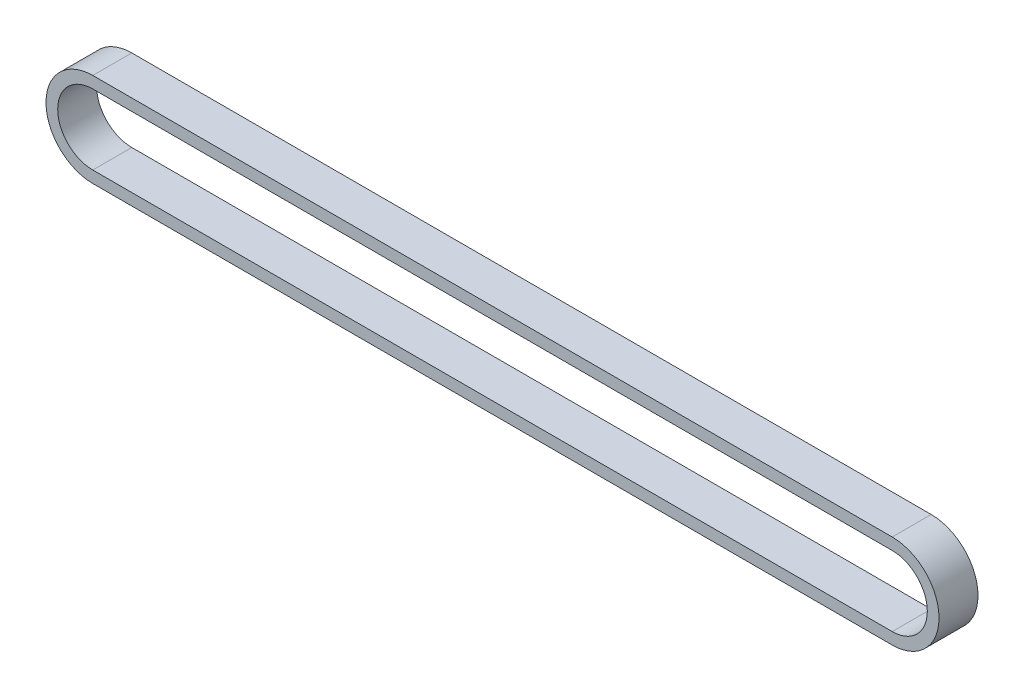
ISO-10303-21;
HEADER;
FILE_DESCRIPTION(('STEP AP214'),'2;1');
FILE_NAME('part.step','',(''),(''),'','','');
FILE_SCHEMA(('AUTOMOTIVE_DESIGN { 1 0 10303 214 1 1 1 1 }'));
ENDSEC;
DATA;
#1=APPLICATION_CONTEXT('core data for automotive mechanical design processes');
#2=APPLICATION_PROTOCOL_DEFINITION('international standard','automotive_design',2000,#1);
#3=PRODUCT_CONTEXT('',#1,'mechanical');
#4=PRODUCT('Part','Part','',(#3));
#5=PRODUCT_RELATED_PRODUCT_CATEGORY('part','',(#4));
#6=PRODUCT_DEFINITION_FORMATION('','',#4);
#7=PRODUCT_DEFINITION_CONTEXT('part definition',#1,'design');
#8=PRODUCT_DEFINITION('design','',#6,#7);
#9=PRODUCT_DEFINITION_SHAPE('','',#8);
#10=(LENGTH_UNIT() NAMED_UNIT(*) SI_UNIT(.MILLI.,.METRE.));
#11=(NAMED_UNIT(*) PLANE_ANGLE_UNIT() SI_UNIT($,.RADIAN.));
#12=(NAMED_UNIT(*) SI_UNIT($,.STERADIAN.) SOLID_ANGLE_UNIT());
#13=UNCERTAINTY_MEASURE_WITH_UNIT(LENGTH_MEASURE(1.E-05),#10,'distance_accuracy_value','');
#14=(GEOMETRIC_REPRESENTATION_CONTEXT(3) GLOBAL_UNCERTAINTY_ASSIGNED_CONTEXT((#13)) GLOBAL_UNIT_ASSIGNED_CONTEXT((#10,
#11,#12)) REPRESENTATION_CONTEXT('',''));
#15=CARTESIAN_POINT('',(0.,0.,0.));
#16=DIRECTION('',(0.,0.,1.));
#17=DIRECTION('',(1.,0.,0.));
#18=AXIS2_PLACEMENT_3D('',#15,#16,#17);
#19=CARTESIAN_POINT('',(0.,0.,10.));
#20=DIRECTION('',(0.,0.,1.));
#21=DIRECTION('',(1.,0.,0.));
#22=AXIS2_PLACEMENT_3D('',#19,#20,#21);
#23=PLANE('',#22);
#24=CARTESIAN_POINT('',(0.,0.,10.));
#25=DIRECTION('',(0.,0.,1.));
#26=DIRECTION('',(1.,0.,0.));
#27=AXIS2_PLACEMENT_3D('',#24,#25,#26);
#28=CIRCLE('',#27,12.);
#29=CARTESIAN_POINT('',(0.,12.,10.));
#30=VERTEX_POINT('',#29);
#31=CARTESIAN_POINT('',(0.,-12.,10.));
#32=VERTEX_POINT('',#31);
#33=EDGE_CURVE('E142',#30,#32,#28,.T.);
#34=ORIENTED_EDGE('',*,*,#33,.T.);
#35=DIRECTION('',(1.,0.,0.));
#36=VECTOR('',#35,1.);
#37=CARTESIAN_POINT('',(0.,-12.,10.));
#38=LINE('',#37,#36);
#39=CARTESIAN_POINT('',(205.,-12.,10.));
#40=VERTEX_POINT('',#39);
#41=EDGE_CURVE('E145',#32,#40,#38,.T.);
#42=ORIENTED_EDGE('',*,*,#41,.T.);
#43=CARTESIAN_POINT('',(205.,0.,10.));
#44=DIRECTION('',(0.,0.,1.));
#45=DIRECTION('',(1.,0.,0.));
#46=AXIS2_PLACEMENT_3D('',#43,#44,#45);
#47=CIRCLE('',#46,12.);
#48=CARTESIAN_POINT('',(205.,12.,10.));
#49=VERTEX_POINT('',#48);
#50=EDGE_CURVE('E148',#40,#49,#47,.T.);
#51=ORIENTED_EDGE('',*,*,#50,.T.);
#52=DIRECTION('',(-1.,0.,0.));
#53=VECTOR('',#52,1.);
#54=CARTESIAN_POINT('',(0.,12.,10.));
#55=LINE('',#54,#53);
#56=EDGE_CURVE('E150',#49,#30,#55,.T.);
#57=ORIENTED_EDGE('',*,*,#56,.T.);
#58=EDGE_LOOP('',(#34,#42,#51,#57));
#59=FACE_BOUND('',#58,.T.);
#60=DIRECTION('',(1.,0.,0.));
#61=VECTOR('',#60,1.);
#62=CARTESIAN_POINT('',(0.,-9.,10.));
#63=LINE('',#62,#61);
#64=CARTESIAN_POINT('',(0.,-9.,10.));
#65=VERTEX_POINT('',#64);
#66=CARTESIAN_POINT('',(205.,-9.,10.));
#67=VERTEX_POINT('',#66);
#68=EDGE_CURVE('E114',#65,#67,#63,.T.);
#69=ORIENTED_EDGE('',*,*,#68,.F.);
#70=CARTESIAN_POINT('',(0.,0.,10.));
#71=DIRECTION('',(0.,0.,1.));
#72=DIRECTION('',(1.,0.,0.));
#73=AXIS2_PLACEMENT_3D('',#70,#71,#72);
#74=CIRCLE('',#73,9.);
#75=CARTESIAN_POINT('',(0.,9.,10.));
#76=VERTEX_POINT('',#75);
#77=EDGE_CURVE('E106',#76,#65,#74,.T.);
#78=ORIENTED_EDGE('',*,*,#77,.F.);
#79=DIRECTION('',(-1.,0.,0.));
#80=VECTOR('',#79,1.);
#81=CARTESIAN_POINT('',(0.,9.,10.));
#82=LINE('',#81,#80);
#83=CARTESIAN_POINT('',(205.,9.,10.));
#84=VERTEX_POINT('',#83);
#85=EDGE_CURVE('E128',#84,#76,#82,.T.);
#86=ORIENTED_EDGE('',*,*,#85,.F.);
#87=CARTESIAN_POINT('',(205.,0.,10.));
#88=DIRECTION('',(0.,0.,1.));
#89=DIRECTION('',(1.,0.,0.));
#90=AXIS2_PLACEMENT_3D('',#87,#88,#89);
#91=CIRCLE('',#90,9.);
#92=EDGE_CURVE('E126',#67,#84,#91,.T.);
#93=ORIENTED_EDGE('',*,*,#92,.F.);
#94=EDGE_LOOP('',(#69,#78,#86,#93));
#95=FACE_BOUND('',#94,.T.);
#96=ADVANCED_FACE('F41',(#59,#95),#23,.T.);
#97=CARTESIAN_POINT('',(0.,0.,0.));
#98=DIRECTION('',(0.,0.,1.));
#99=DIRECTION('',(1.,0.,0.));
#100=AXIS2_PLACEMENT_3D('',#97,#98,#99);
#101=PLANE('',#100);
#102=CARTESIAN_POINT('',(0.,0.,0.));
#103=DIRECTION('',(0.,0.,1.));
#104=DIRECTION('',(1.,0.,0.));
#105=AXIS2_PLACEMENT_3D('',#102,#103,#104);
#106=CIRCLE('',#105,12.);
#107=CARTESIAN_POINT('',(0.,12.,0.));
#108=VERTEX_POINT('',#107);
#109=CARTESIAN_POINT('',(0.,-12.,0.));
#110=VERTEX_POINT('',#109);
#111=EDGE_CURVE('E122',#108,#110,#106,.T.);
#112=ORIENTED_EDGE('',*,*,#111,.F.);
#113=DIRECTION('',(-1.,0.,0.));
#114=VECTOR('',#113,1.);
#115=CARTESIAN_POINT('',(0.,12.,0.));
#116=LINE('',#115,#114);
#117=CARTESIAN_POINT('',(205.,12.,0.));
#118=VERTEX_POINT('',#117);
#119=EDGE_CURVE('E146',#118,#108,#116,.T.);
#120=ORIENTED_EDGE('',*,*,#119,.F.);
#121=CARTESIAN_POINT('',(205.,0.,0.));
#122=DIRECTION('',(0.,0.,1.));
#123=DIRECTION('',(1.,0.,0.));
#124=AXIS2_PLACEMENT_3D('',#121,#122,#123);
#125=CIRCLE('',#124,12.);
#126=CARTESIAN_POINT('',(205.,-12.,0.));
#127=VERTEX_POINT('',#126);
#128=EDGE_CURVE('E157',#127,#118,#125,.T.);
#129=ORIENTED_EDGE('',*,*,#128,.F.);
#130=DIRECTION('',(1.,0.,0.));
#131=VECTOR('',#130,1.);
#132=CARTESIAN_POINT('',(0.,-12.,0.));
#133=LINE('',#132,#131);
#134=EDGE_CURVE('E155',#110,#127,#133,.T.);
#135=ORIENTED_EDGE('',*,*,#134,.F.);
#136=EDGE_LOOP('',(#112,#120,#129,#135));
#137=FACE_BOUND('',#136,.T.);
#138=CARTESIAN_POINT('',(0.,0.,0.));
#139=DIRECTION('',(0.,0.,1.));
#140=DIRECTION('',(1.,0.,0.));
#141=AXIS2_PLACEMENT_3D('',#138,#139,#140);
#142=CIRCLE('',#141,9.);
#143=CARTESIAN_POINT('',(0.,9.,0.));
#144=VERTEX_POINT('',#143);
#145=CARTESIAN_POINT('',(0.,-9.,0.));
#146=VERTEX_POINT('',#145);
#147=EDGE_CURVE('E64',#144,#146,#142,.T.);
#148=ORIENTED_EDGE('',*,*,#147,.T.);
#149=DIRECTION('',(1.,0.,0.));
#150=VECTOR('',#149,1.);
#151=CARTESIAN_POINT('',(0.,-9.,0.));
#152=LINE('',#151,#150);
#153=CARTESIAN_POINT('',(205.,-9.,0.));
#154=VERTEX_POINT('',#153);
#155=EDGE_CURVE('E121',#146,#154,#152,.T.);
#156=ORIENTED_EDGE('',*,*,#155,.T.);
#157=CARTESIAN_POINT('',(205.,0.,0.));
#158=DIRECTION('',(0.,0.,1.));
#159=DIRECTION('',(1.,0.,0.));
#160=AXIS2_PLACEMENT_3D('',#157,#158,#159);
#161=CIRCLE('',#160,9.);
#162=CARTESIAN_POINT('',(205.,9.,0.));
#163=VERTEX_POINT('',#162);
#164=EDGE_CURVE('E134',#154,#163,#161,.T.);
#165=ORIENTED_EDGE('',*,*,#164,.T.);
#166=DIRECTION('',(-1.,0.,0.));
#167=VECTOR('',#166,1.);
#168=CARTESIAN_POINT('',(0.,9.,0.));
#169=LINE('',#168,#167);
#170=EDGE_CURVE('E115',#163,#144,#169,.T.);
#171=ORIENTED_EDGE('',*,*,#170,.T.);
#172=EDGE_LOOP('',(#148,#156,#165,#171));
#173=FACE_BOUND('',#172,.T.);
#174=ADVANCED_FACE('F175',(#137,#173),#101,.F.);
#175=CARTESIAN_POINT('',(0.,0.,10.));
#176=DIRECTION('',(0.,0.,-1.));
#177=DIRECTION('',(-1.,0.,0.));
#178=AXIS2_PLACEMENT_3D('',#175,#176,#177);
#179=CYLINDRICAL_SURFACE('',#178,12.);
#180=ORIENTED_EDGE('',*,*,#111,.T.);
#181=DIRECTION('',(0.,0.,-1.));
#182=VECTOR('',#181,1.);
#183=CARTESIAN_POINT('',(0.,-12.,10.));
#184=LINE('',#183,#182);
#185=EDGE_CURVE('E11',#32,#110,#184,.T.);
#186=ORIENTED_EDGE('',*,*,#185,.F.);
#187=ORIENTED_EDGE('',*,*,#33,.F.);
#188=DIRECTION('',(0.,0.,-1.));
#189=VECTOR('',#188,1.);
#190=CARTESIAN_POINT('',(0.,12.,10.));
#191=LINE('',#190,#189);
#192=EDGE_CURVE('E152',#30,#108,#191,.T.);
#193=ORIENTED_EDGE('',*,*,#192,.T.);
#194=EDGE_LOOP('',(#180,#186,#187,#193));
#195=FACE_BOUND('',#194,.T.);
#196=ADVANCED_FACE('F43',(#195),#179,.T.);
#197=CARTESIAN_POINT('',(0.,-12.,10.));
#198=DIRECTION('',(0.,1.,0.));
#199=DIRECTION('',(0.,0.,1.));
#200=AXIS2_PLACEMENT_3D('',#197,#198,#199);
#201=PLANE('',#200);
#202=ORIENTED_EDGE('',*,*,#134,.T.);
#203=DIRECTION('',(0.,0.,-1.));
#204=VECTOR('',#203,1.);
#205=CARTESIAN_POINT('',(205.,-12.,10.));
#206=LINE('',#205,#204);
#207=EDGE_CURVE('E49',#40,#127,#206,.T.);
#208=ORIENTED_EDGE('',*,*,#207,.F.);
#209=ORIENTED_EDGE('',*,*,#41,.F.);
#210=ORIENTED_EDGE('',*,*,#185,.T.);
#211=EDGE_LOOP('',(#202,#208,#209,#210));
#212=FACE_BOUND('',#211,.T.);
#213=ADVANCED_FACE('F185',(#212),#201,.F.);
#214=CARTESIAN_POINT('',(205.,0.,10.));
#215=DIRECTION('',(0.,0.,-1.));
#216=DIRECTION('',(-1.,0.,0.));
#217=AXIS2_PLACEMENT_3D('',#214,#215,#216);
#218=CYLINDRICAL_SURFACE('',#217,12.);
#219=ORIENTED_EDGE('',*,*,#128,.T.);
#220=DIRECTION('',(0.,0.,-1.));
#221=VECTOR('',#220,1.);
#222=CARTESIAN_POINT('',(205.,12.,10.));
#223=LINE('',#222,#221);
#224=EDGE_CURVE('E162',#49,#118,#223,.T.);
#225=ORIENTED_EDGE('',*,*,#224,.F.);
#226=ORIENTED_EDGE('',*,*,#50,.F.);
#227=ORIENTED_EDGE('',*,*,#207,.T.);
#228=EDGE_LOOP('',(#219,#225,#226,#227));
#229=FACE_BOUND('',#228,.T.);
#230=ADVANCED_FACE('F169',(#229),#218,.T.);
#231=CARTESIAN_POINT('',(0.,12.,10.));
#232=DIRECTION('',(0.,-1.,0.));
#233=DIRECTION('',(0.,0.,-1.));
#234=AXIS2_PLACEMENT_3D('',#231,#232,#233);
#235=PLANE('',#234);
#236=ORIENTED_EDGE('',*,*,#119,.T.);
#237=ORIENTED_EDGE('',*,*,#192,.F.);
#238=ORIENTED_EDGE('',*,*,#56,.F.);
#239=ORIENTED_EDGE('',*,*,#224,.T.);
#240=EDGE_LOOP('',(#236,#237,#238,#239));
#241=FACE_BOUND('',#240,.T.);
#242=ADVANCED_FACE('F179',(#241),#235,.F.);
#243=CARTESIAN_POINT('',(0.,0.,10.));
#244=DIRECTION('',(0.,0.,-1.));
#245=DIRECTION('',(-1.,0.,0.));
#246=AXIS2_PLACEMENT_3D('',#243,#244,#245);
#247=CYLINDRICAL_SURFACE('',#246,9.);
#248=ORIENTED_EDGE('',*,*,#147,.F.);
#249=DIRECTION('',(0.,0.,-1.));
#250=VECTOR('',#249,1.);
#251=CARTESIAN_POINT('',(0.,9.,10.));
#252=LINE('',#251,#250);
#253=EDGE_CURVE('E110',#76,#144,#252,.T.);
#254=ORIENTED_EDGE('',*,*,#253,.F.);
#255=ORIENTED_EDGE('',*,*,#77,.T.);
#256=DIRECTION('',(0.,0.,-1.));
#257=VECTOR('',#256,1.);
#258=CARTESIAN_POINT('',(0.,-9.,10.));
#259=LINE('',#258,#257);
#260=EDGE_CURVE('E109',#65,#146,#259,.T.);
#261=ORIENTED_EDGE('',*,*,#260,.T.);
#262=EDGE_LOOP('',(#248,#254,#255,#261));
#263=FACE_BOUND('',#262,.T.);
#264=ADVANCED_FACE('F108',(#263),#247,.F.);
#265=CARTESIAN_POINT('',(0.,-9.,10.));
#266=DIRECTION('',(0.,1.,0.));
#267=DIRECTION('',(0.,0.,1.));
#268=AXIS2_PLACEMENT_3D('',#265,#266,#267);
#269=PLANE('',#268);
#270=ORIENTED_EDGE('',*,*,#155,.F.);
#271=ORIENTED_EDGE('',*,*,#260,.F.);
#272=ORIENTED_EDGE('',*,*,#68,.T.);
#273=DIRECTION('',(0.,0.,-1.));
#274=VECTOR('',#273,1.);
#275=CARTESIAN_POINT('',(205.,-9.,10.));
#276=LINE('',#275,#274);
#277=EDGE_CURVE('E123',#67,#154,#276,.T.);
#278=ORIENTED_EDGE('',*,*,#277,.T.);
#279=EDGE_LOOP('',(#270,#271,#272,#278));
#280=FACE_BOUND('',#279,.T.);
#281=ADVANCED_FACE('F118',(#280),#269,.T.);
#282=CARTESIAN_POINT('',(205.,0.,10.));
#283=DIRECTION('',(0.,0.,-1.));
#284=DIRECTION('',(-1.,0.,0.));
#285=AXIS2_PLACEMENT_3D('',#282,#283,#284);
#286=CYLINDRICAL_SURFACE('',#285,9.);
#287=ORIENTED_EDGE('',*,*,#164,.F.);
#288=ORIENTED_EDGE('',*,*,#277,.F.);
#289=ORIENTED_EDGE('',*,*,#92,.T.);
#290=DIRECTION('',(0.,0.,-1.));
#291=VECTOR('',#290,1.);
#292=CARTESIAN_POINT('',(205.,9.,10.));
#293=LINE('',#292,#291);
#294=EDGE_CURVE('E56',#84,#163,#293,.T.);
#295=ORIENTED_EDGE('',*,*,#294,.T.);
#296=EDGE_LOOP('',(#287,#288,#289,#295));
#297=FACE_BOUND('',#296,.T.);
#298=ADVANCED_FACE('F208',(#297),#286,.F.);
#299=CARTESIAN_POINT('',(0.,9.,10.));
#300=DIRECTION('',(0.,-1.,0.));
#301=DIRECTION('',(0.,0.,-1.));
#302=AXIS2_PLACEMENT_3D('',#299,#300,#301);
#303=PLANE('',#302);
#304=ORIENTED_EDGE('',*,*,#170,.F.);
#305=ORIENTED_EDGE('',*,*,#294,.F.);
#306=ORIENTED_EDGE('',*,*,#85,.T.);
#307=ORIENTED_EDGE('',*,*,#253,.T.);
#308=EDGE_LOOP('',(#304,#305,#306,#307));
#309=FACE_BOUND('',#308,.T.);
#310=ADVANCED_FACE('F212',(#309),#303,.T.);
#311=CLOSED_SHELL('',(#96,#174,#196,#213,#230,#242,#264,#281,#298,#310));
#312=MANIFOLD_SOLID_BREP('B2',#311);
#313=ADVANCED_BREP_SHAPE_REPRESENTATION('',(#18,#312),#14);
#314=SHAPE_DEFINITION_REPRESENTATION(#9,#313);
ENDSEC;
END-ISO-10303-21;
